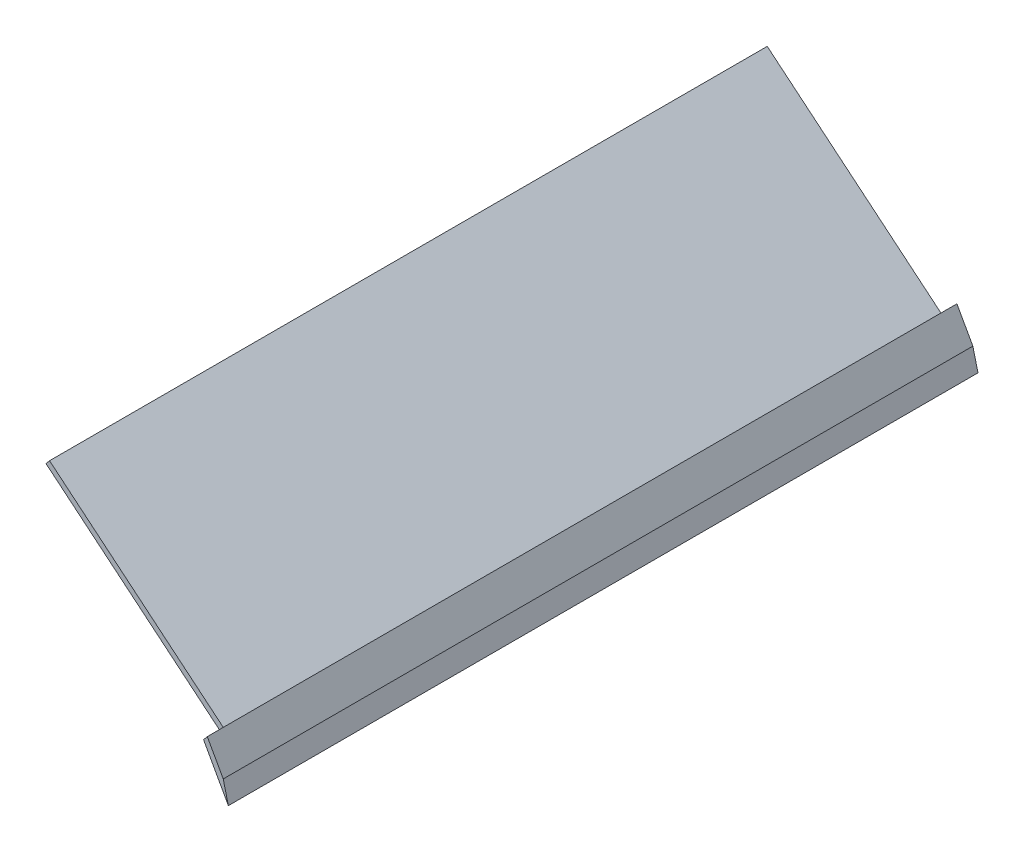
ISO-10303-21;
HEADER;
FILE_DESCRIPTION(('STEP AP214'),'2;1');
FILE_NAME('part.step','',(''),(''),'','','');
FILE_SCHEMA(('AUTOMOTIVE_DESIGN { 1 0 10303 214 1 1 1 1 }'));
ENDSEC;
DATA;
#1=APPLICATION_CONTEXT('core data for automotive mechanical design processes');
#2=APPLICATION_PROTOCOL_DEFINITION('international standard','automotive_design',2000,#1);
#3=PRODUCT_CONTEXT('',#1,'mechanical');
#4=PRODUCT('Part','Part','',(#3));
#5=PRODUCT_RELATED_PRODUCT_CATEGORY('part','',(#4));
#6=PRODUCT_DEFINITION_FORMATION('','',#4);
#7=PRODUCT_DEFINITION_CONTEXT('part definition',#1,'design');
#8=PRODUCT_DEFINITION('design','',#6,#7);
#9=PRODUCT_DEFINITION_SHAPE('','',#8);
#10=(LENGTH_UNIT() NAMED_UNIT(*) SI_UNIT(.MILLI.,.METRE.));
#11=(NAMED_UNIT(*) PLANE_ANGLE_UNIT() SI_UNIT($,.RADIAN.));
#12=(NAMED_UNIT(*) SI_UNIT($,.STERADIAN.) SOLID_ANGLE_UNIT());
#13=UNCERTAINTY_MEASURE_WITH_UNIT(LENGTH_MEASURE(1.E-05),#10,'distance_accuracy_value','');
#14=(GEOMETRIC_REPRESENTATION_CONTEXT(3) GLOBAL_UNCERTAINTY_ASSIGNED_CONTEXT((#13)) GLOBAL_UNIT_ASSIGNED_CONTEXT((#10,
#11,#12)) REPRESENTATION_CONTEXT('',''));
#15=CARTESIAN_POINT('',(0.,0.,0.));
#16=DIRECTION('',(0.,0.,1.));
#17=DIRECTION('',(1.,0.,0.));
#18=AXIS2_PLACEMENT_3D('',#15,#16,#17);
#19=CARTESIAN_POINT('',(-4.00000000000001,299.8,-215.9));
#20=DIRECTION('',(0.,0.,-1.));
#21=DIRECTION('',(-1.,0.,0.));
#22=AXIS2_PLACEMENT_3D('',#19,#20,#21);
#23=PLANE('',#22);
#24=DIRECTION('',(0.638397023653891,0.769707243170969,0.));
#25=VECTOR('',#24,1.);
#26=CARTESIAN_POINT('',(160.852636387583,100.367126800072,-215.9));
#27=LINE('',#26,#25);
#28=CARTESIAN_POINT('',(187.548956175747,132.554543009109,-215.9));
#29=VERTEX_POINT('',#28);
#30=CARTESIAN_POINT('',(188.631521839889,133.859778782498,-215.9));
#31=VERTEX_POINT('',#30);
#32=EDGE_CURVE('E47',#29,#31,#27,.T.);
#33=ORIENTED_EDGE('',*,*,#32,.T.);
#34=DIRECTION('',(-0.48534298368411,0.874323846288437,0.));
#35=VECTOR('',#34,1.);
#36=CARTESIAN_POINT('',(188.631521839889,133.859778782498,-215.9));
#37=LINE('',#36,#35);
#38=CARTESIAN_POINT('',(193.220657017504,125.592655419195,-215.9));
#39=VERTEX_POINT('',#38);
#40=EDGE_CURVE('E125',#39,#31,#37,.T.);
#41=ORIENTED_EDGE('',*,*,#40,.F.);
#42=DIRECTION('',(-0.242513659541949,0.970147991254722,0.));
#43=VECTOR('',#42,1.);
#44=CARTESIAN_POINT('',(194.701118325614,119.670240298718,-215.9));
#45=LINE('',#44,#43);
#46=CARTESIAN_POINT('',(194.701118325614,119.670240298718,-215.9));
#47=VERTEX_POINT('',#46);
#48=EDGE_CURVE('E137',#47,#39,#45,.T.);
#49=ORIENTED_EDGE('',*,*,#48,.F.);
#50=DIRECTION('',(0.485342983684112,-0.874323846288436,0.));
#51=VECTOR('',#50,1.);
#52=CARTESIAN_POINT('',(187.420973570352,132.785097993045,-215.9));
#53=LINE('',#52,#51);
#54=EDGE_CURVE('E142',#29,#47,#53,.T.);
#55=ORIENTED_EDGE('',*,*,#54,.F.);
#56=EDGE_LOOP('',(#33,#41,#49,#55));
#57=FACE_BOUND('',#56,.T.);
#58=ADVANCED_FACE('F33',(#57),#23,.T.);
#59=CARTESIAN_POINT('',(0.,0.,0.));
#60=DIRECTION('',(0.,0.,1.));
#61=DIRECTION('',(1.,0.,0.));
#62=AXIS2_PLACEMENT_3D('',#59,#60,#61);
#63=PLANE('',#62);
#64=DIRECTION('',(0.638397023653891,0.769707243170969,0.));
#65=VECTOR('',#64,1.);
#66=CARTESIAN_POINT('',(160.852636387583,100.367126800072,0.));
#67=LINE('',#66,#65);
#68=CARTESIAN_POINT('',(187.548956175747,132.554543009109,0.));
#69=VERTEX_POINT('',#68);
#70=CARTESIAN_POINT('',(188.631521839889,133.859778782498,0.));
#71=VERTEX_POINT('',#70);
#72=EDGE_CURVE('E160',#69,#71,#67,.T.);
#73=ORIENTED_EDGE('',*,*,#72,.F.);
#74=DIRECTION('',(0.485342983684112,-0.874323846288436,0.));
#75=VECTOR('',#74,1.);
#76=CARTESIAN_POINT('',(187.420973570352,132.785097993045,0.));
#77=LINE('',#76,#75);
#78=CARTESIAN_POINT('',(194.701118325614,119.670240298718,0.));
#79=VERTEX_POINT('',#78);
#80=EDGE_CURVE('E157',#69,#79,#77,.T.);
#81=ORIENTED_EDGE('',*,*,#80,.T.);
#82=DIRECTION('',(-0.242513659541949,0.970147991254722,0.));
#83=VECTOR('',#82,1.);
#84=CARTESIAN_POINT('',(194.701118325614,119.670240298718,0.));
#85=LINE('',#84,#83);
#86=CARTESIAN_POINT('',(193.220657017504,125.592655419195,0.));
#87=VERTEX_POINT('',#86);
#88=EDGE_CURVE('E176',#79,#87,#85,.T.);
#89=ORIENTED_EDGE('',*,*,#88,.T.);
#90=DIRECTION('',(-0.48534298368411,0.874323846288437,0.));
#91=VECTOR('',#90,1.);
#92=CARTESIAN_POINT('',(188.631521839889,133.859778782498,0.));
#93=LINE('',#92,#91);
#94=EDGE_CURVE('E166',#87,#71,#93,.T.);
#95=ORIENTED_EDGE('',*,*,#94,.T.);
#96=EDGE_LOOP('',(#73,#81,#89,#95));
#97=FACE_BOUND('',#96,.T.);
#98=ADVANCED_FACE('F163',(#97),#63,.T.);
#99=CARTESIAN_POINT('',(194.701118325614,119.670240298718,-295.673308964468));
#100=DIRECTION('',(0.970147991254722,0.242513659541949,0.));
#101=DIRECTION('',(-0.242513659541949,0.970147991254722,0.));
#102=AXIS2_PLACEMENT_3D('',#99,#100,#101);
#103=PLANE('',#102);
#104=DIRECTION('',(0.,0.,1.));
#105=VECTOR('',#104,1.);
#106=CARTESIAN_POINT('',(194.701118325614,119.670240298718,-295.673308964468));
#107=LINE('',#106,#105);
#108=EDGE_CURVE('E138',#47,#79,#107,.T.);
#109=ORIENTED_EDGE('',*,*,#108,.F.);
#110=ORIENTED_EDGE('',*,*,#48,.T.);
#111=DIRECTION('',(0.,0.,1.));
#112=VECTOR('',#111,1.);
#113=CARTESIAN_POINT('',(193.220657017504,125.592655419195,-295.673308964468));
#114=LINE('',#113,#112);
#115=EDGE_CURVE('E135',#39,#87,#114,.T.);
#116=ORIENTED_EDGE('',*,*,#115,.T.);
#117=ORIENTED_EDGE('',*,*,#88,.F.);
#118=EDGE_LOOP('',(#109,#110,#116,#117));
#119=FACE_BOUND('',#118,.T.);
#120=ADVANCED_FACE('F202',(#119),#103,.T.);
#121=CARTESIAN_POINT('',(188.631521839889,133.859778782498,-295.673308964468));
#122=DIRECTION('',(0.874323846288437,0.48534298368411,0.));
#123=DIRECTION('',(-0.48534298368411,0.874323846288437,0.));
#124=AXIS2_PLACEMENT_3D('',#121,#122,#123);
#125=PLANE('',#124);
#126=ORIENTED_EDGE('',*,*,#115,.F.);
#127=ORIENTED_EDGE('',*,*,#40,.T.);
#128=DIRECTION('',(0.,0.,1.));
#129=VECTOR('',#128,1.);
#130=CARTESIAN_POINT('',(188.631521839889,133.859778782498,-295.673308964468));
#131=LINE('',#130,#129);
#132=CARTESIAN_POINT('',(188.631521839889,133.859778782498,-211.3));
#133=VERTEX_POINT('',#132);
#134=EDGE_CURVE('E105',#31,#133,#131,.T.);
#135=ORIENTED_EDGE('',*,*,#134,.T.);
#136=CARTESIAN_POINT('',(188.631521839889,133.859778782498,-4.6));
#137=VERTEX_POINT('',#136);
#138=EDGE_CURVE('E119',#133,#137,#131,.T.);
#139=ORIENTED_EDGE('',*,*,#138,.T.);
#140=DIRECTION('',(0.,0.,-1.));
#141=VECTOR('',#140,1.);
#142=CARTESIAN_POINT('',(188.631521839889,133.859778782498,-4.6));
#143=LINE('',#142,#141);
#144=EDGE_CURVE('E170',#71,#137,#143,.T.);
#145=ORIENTED_EDGE('',*,*,#144,.F.);
#146=ORIENTED_EDGE('',*,*,#94,.F.);
#147=EDGE_LOOP('',(#126,#127,#135,#139,#145,#146));
#148=FACE_BOUND('',#147,.T.);
#149=ADVANCED_FACE('F129',(#148),#125,.T.);
#150=CARTESIAN_POINT('',(188.631521839889,133.859778782498,-295.673308964468));
#151=DIRECTION('',(0.638397023653891,0.769707243170969,0.));
#152=DIRECTION('',(-0.769707243170969,0.638397023653891,0.));
#153=AXIS2_PLACEMENT_3D('',#150,#151,#152);
#154=PLANE('',#153);
#155=DIRECTION('',(0.769707243170969,-0.638397023653891,0.));
#156=VECTOR('',#155,1.);
#157=CARTESIAN_POINT('',(138.600551033776,175.355585320001,-211.3));
#158=LINE('',#157,#156);
#159=CARTESIAN_POINT('',(138.600551033776,175.355585320001,-211.3));
#160=VERTEX_POINT('',#159);
#161=EDGE_CURVE('E108',#160,#133,#158,.T.);
#162=ORIENTED_EDGE('',*,*,#161,.F.);
#163=DIRECTION('',(0.,0.,1.));
#164=VECTOR('',#163,1.);
#165=CARTESIAN_POINT('',(138.600551033776,175.355585320001,-295.673308964468));
#166=LINE('',#165,#164);
#167=CARTESIAN_POINT('',(138.600551033776,175.355585320001,-4.59999999999999));
#168=VERTEX_POINT('',#167);
#169=EDGE_CURVE('E130',#160,#168,#166,.T.);
#170=ORIENTED_EDGE('',*,*,#169,.T.);
#171=DIRECTION('',(-0.769707243170969,0.638397023653891,0.));
#172=VECTOR('',#171,1.);
#173=CARTESIAN_POINT('',(138.600551033776,175.355585320001,-4.59999999999999));
#174=LINE('',#173,#172);
#175=EDGE_CURVE('E122',#137,#168,#174,.T.);
#176=ORIENTED_EDGE('',*,*,#175,.F.);
#177=ORIENTED_EDGE('',*,*,#138,.F.);
#178=EDGE_LOOP('',(#162,#170,#176,#177));
#179=FACE_BOUND('',#178,.T.);
#180=ADVANCED_FACE('F120',(#179),#154,.T.);
#181=CARTESIAN_POINT('',(137.57911579593,174.124053730927,-295.673308964468));
#182=DIRECTION('',(-0.769707243170967,0.638397023653893,0.));
#183=DIRECTION('',(-0.638397023653893,-0.769707243170967,0.));
#184=AXIS2_PLACEMENT_3D('',#181,#182,#183);
#185=PLANE('',#184);
#186=DIRECTION('',(0.638397023653891,0.769707243170969,0.));
#187=VECTOR('',#186,1.);
#188=CARTESIAN_POINT('',(110.82166558147,141.862933337575,-211.3));
#189=LINE('',#188,#187);
#190=CARTESIAN_POINT('',(137.57911579593,174.124053730927,-211.3));
#191=VERTEX_POINT('',#190);
#192=EDGE_CURVE('E114',#191,#160,#189,.T.);
#193=ORIENTED_EDGE('',*,*,#192,.F.);
#194=DIRECTION('',(0.,0.,1.));
#195=VECTOR('',#194,1.);
#196=CARTESIAN_POINT('',(137.57911579593,174.124053730927,-295.673308964468));
#197=LINE('',#196,#195);
#198=CARTESIAN_POINT('',(137.57911579593,174.124053730927,-4.59999999999999));
#199=VERTEX_POINT('',#198);
#200=EDGE_CURVE('E131',#191,#199,#197,.T.);
#201=ORIENTED_EDGE('',*,*,#200,.T.);
#202=DIRECTION('',(0.638397023653891,0.769707243170969,0.));
#203=VECTOR('',#202,1.);
#204=CARTESIAN_POINT('',(110.82166558147,141.862933337575,-4.59999999999999));
#205=LINE('',#204,#203);
#206=EDGE_CURVE('E168',#199,#168,#205,.T.);
#207=ORIENTED_EDGE('',*,*,#206,.T.);
#208=ORIENTED_EDGE('',*,*,#169,.F.);
#209=EDGE_LOOP('',(#193,#201,#207,#208));
#210=FACE_BOUND('',#209,.T.);
#211=ADVANCED_FACE('F187',(#210),#185,.T.);
#212=CARTESIAN_POINT('',(187.420973570352,132.785097993045,-295.673308964468));
#213=DIRECTION('',(-0.638397023653891,-0.769707243170969,0.));
#214=DIRECTION('',(0.76970724317097,-0.638397023653891,0.));
#215=AXIS2_PLACEMENT_3D('',#212,#213,#214);
#216=PLANE('',#215);
#217=DIRECTION('',(-0.76970724317097,0.638397023653891,0.));
#218=VECTOR('',#217,1.);
#219=CARTESIAN_POINT('',(187.420973570352,132.785097993045,-211.3));
#220=LINE('',#219,#218);
#221=CARTESIAN_POINT('',(187.420973570352,132.785097993045,-211.3));
#222=VERTEX_POINT('',#221);
#223=EDGE_CURVE('E191',#222,#191,#220,.T.);
#224=ORIENTED_EDGE('',*,*,#223,.F.);
#225=DIRECTION('',(0.,0.,1.));
#226=VECTOR('',#225,1.);
#227=CARTESIAN_POINT('',(187.420973570352,132.785097993045,-295.673308964468));
#228=LINE('',#227,#226);
#229=CARTESIAN_POINT('',(187.420973570352,132.785097993045,-4.59999999999999));
#230=VERTEX_POINT('',#229);
#231=EDGE_CURVE('E182',#222,#230,#228,.T.);
#232=ORIENTED_EDGE('',*,*,#231,.T.);
#233=DIRECTION('',(0.76970724317097,-0.638397023653891,0.));
#234=VECTOR('',#233,1.);
#235=CARTESIAN_POINT('',(187.420973570352,132.785097993045,-4.59999999999999));
#236=LINE('',#235,#234);
#237=EDGE_CURVE('E152',#199,#230,#236,.T.);
#238=ORIENTED_EDGE('',*,*,#237,.F.);
#239=ORIENTED_EDGE('',*,*,#200,.F.);
#240=EDGE_LOOP('',(#224,#232,#238,#239));
#241=FACE_BOUND('',#240,.T.);
#242=ADVANCED_FACE('F190',(#241),#216,.T.);
#243=CARTESIAN_POINT('',(187.420973570352,132.785097993045,-295.673308964468));
#244=DIRECTION('',(-0.874323846288436,-0.485342983684112,0.));
#245=DIRECTION('',(0.485342983684112,-0.874323846288436,0.));
#246=AXIS2_PLACEMENT_3D('',#243,#244,#245);
#247=PLANE('',#246);
#248=DIRECTION('',(-0.485342983684112,0.874323846288436,0.));
#249=VECTOR('',#248,1.);
#250=CARTESIAN_POINT('',(187.420973570352,132.785097993045,-211.3));
#251=LINE('',#250,#249);
#252=CARTESIAN_POINT('',(187.548956175747,132.554543009109,-211.3));
#253=VERTEX_POINT('',#252);
#254=EDGE_CURVE('E11',#253,#222,#251,.T.);
#255=ORIENTED_EDGE('',*,*,#254,.F.);
#256=DIRECTION('',(0.,0.,1.));
#257=VECTOR('',#256,1.);
#258=CARTESIAN_POINT('',(187.548956175747,132.554543009109,-295.673308964468));
#259=LINE('',#258,#257);
#260=EDGE_CURVE('E40',#29,#253,#259,.T.);
#261=ORIENTED_EDGE('',*,*,#260,.F.);
#262=ORIENTED_EDGE('',*,*,#54,.T.);
#263=ORIENTED_EDGE('',*,*,#108,.T.);
#264=ORIENTED_EDGE('',*,*,#80,.F.);
#265=DIRECTION('',(0.,0.,1.));
#266=VECTOR('',#265,1.);
#267=CARTESIAN_POINT('',(187.548956175747,132.554543009109,-295.673308964468));
#268=LINE('',#267,#266);
#269=CARTESIAN_POINT('',(187.548956175747,132.554543009109,-4.60000000000005));
#270=VERTEX_POINT('',#269);
#271=EDGE_CURVE('E141',#270,#69,#268,.T.);
#272=ORIENTED_EDGE('',*,*,#271,.F.);
#273=DIRECTION('',(0.485342983684112,-0.874323846288436,0.));
#274=VECTOR('',#273,1.);
#275=CARTESIAN_POINT('',(187.420973570352,132.785097993045,-4.59999999999999));
#276=LINE('',#275,#274);
#277=EDGE_CURVE('E144',#230,#270,#276,.T.);
#278=ORIENTED_EDGE('',*,*,#277,.F.);
#279=ORIENTED_EDGE('',*,*,#231,.F.);
#280=EDGE_LOOP('',(#255,#261,#262,#263,#264,#272,#278,#279));
#281=FACE_BOUND('',#280,.T.);
#282=ADVANCED_FACE('F156',(#281),#247,.T.);
#283=CARTESIAN_POINT('',(110.82166558147,141.862933337575,-4.59999999999999));
#284=DIRECTION('',(0.,0.,-1.));
#285=DIRECTION('',(-1.,0.,0.));
#286=AXIS2_PLACEMENT_3D('',#283,#284,#285);
#287=PLANE('',#286);
#288=ORIENTED_EDGE('',*,*,#237,.T.);
#289=ORIENTED_EDGE('',*,*,#277,.T.);
#290=DIRECTION('',(0.638397023653891,0.769707243170969,0.));
#291=VECTOR('',#290,1.);
#292=CARTESIAN_POINT('',(160.852636387583,100.367126800072,-4.6));
#293=LINE('',#292,#291);
#294=EDGE_CURVE('E55',#270,#137,#293,.T.);
#295=ORIENTED_EDGE('',*,*,#294,.T.);
#296=ORIENTED_EDGE('',*,*,#175,.T.);
#297=ORIENTED_EDGE('',*,*,#206,.F.);
#298=EDGE_LOOP('',(#288,#289,#295,#296,#297));
#299=FACE_BOUND('',#298,.T.);
#300=ADVANCED_FACE('F149',(#299),#287,.F.);
#301=CARTESIAN_POINT('',(160.852636387583,100.367126800072,-4.6));
#302=DIRECTION('',(0.769707243170969,-0.638397023653891,0.));
#303=DIRECTION('',(0.638397023653891,0.769707243170969,0.));
#304=AXIS2_PLACEMENT_3D('',#301,#302,#303);
#305=PLANE('',#304);
#306=ORIENTED_EDGE('',*,*,#271,.T.);
#307=ORIENTED_EDGE('',*,*,#72,.T.);
#308=ORIENTED_EDGE('',*,*,#144,.T.);
#309=ORIENTED_EDGE('',*,*,#294,.F.);
#310=EDGE_LOOP('',(#306,#307,#308,#309));
#311=FACE_BOUND('',#310,.T.);
#312=ADVANCED_FACE('F159',(#311),#305,.F.);
#313=CARTESIAN_POINT('',(110.82166558147,141.862933337575,-211.3));
#314=DIRECTION('',(0.,0.,1.));
#315=DIRECTION('',(1.,0.,0.));
#316=AXIS2_PLACEMENT_3D('',#313,#314,#315);
#317=PLANE('',#316);
#318=ORIENTED_EDGE('',*,*,#223,.T.);
#319=ORIENTED_EDGE('',*,*,#192,.T.);
#320=ORIENTED_EDGE('',*,*,#161,.T.);
#321=DIRECTION('',(0.638397023653891,0.769707243170969,0.));
#322=VECTOR('',#321,1.);
#323=CARTESIAN_POINT('',(160.852636387583,100.367126800072,-211.3));
#324=LINE('',#323,#322);
#325=EDGE_CURVE('E101',#253,#133,#324,.T.);
#326=ORIENTED_EDGE('',*,*,#325,.F.);
#327=ORIENTED_EDGE('',*,*,#254,.T.);
#328=EDGE_LOOP('',(#318,#319,#320,#326,#327));
#329=FACE_BOUND('',#328,.T.);
#330=ADVANCED_FACE('F112',(#329),#317,.F.);
#331=CARTESIAN_POINT('',(160.852636387583,100.367126800072,-211.3));
#332=DIRECTION('',(0.769707243170969,-0.638397023653891,0.));
#333=DIRECTION('',(0.638397023653891,0.769707243170969,0.));
#334=AXIS2_PLACEMENT_3D('',#331,#332,#333);
#335=PLANE('',#334);
#336=ORIENTED_EDGE('',*,*,#260,.T.);
#337=ORIENTED_EDGE('',*,*,#325,.T.);
#338=ORIENTED_EDGE('',*,*,#134,.F.);
#339=ORIENTED_EDGE('',*,*,#32,.F.);
#340=EDGE_LOOP('',(#336,#337,#338,#339));
#341=FACE_BOUND('',#340,.T.);
#342=ADVANCED_FACE('F103',(#341),#335,.F.);
#343=CLOSED_SHELL('',(#58,#98,#120,#149,#180,#211,#242,#282,#300,#312,#330,#342));
#344=MANIFOLD_SOLID_BREP('B2',#343);
#345=ADVANCED_BREP_SHAPE_REPRESENTATION('',(#18,#344),#14);
#346=SHAPE_DEFINITION_REPRESENTATION(#9,#345);
ENDSEC;
END-ISO-10303-21;
